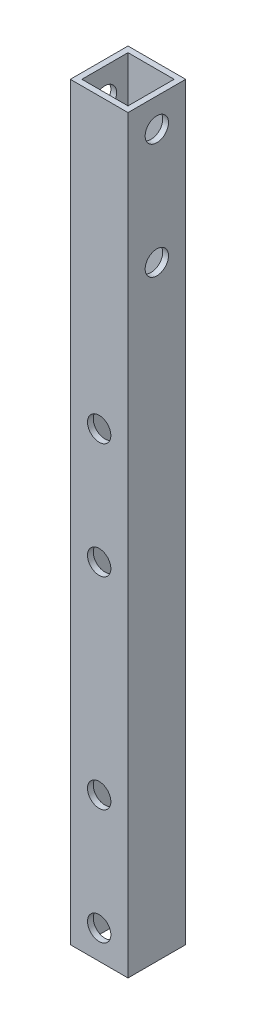
ISO-10303-21;
HEADER;
FILE_DESCRIPTION(('STEP AP214'),'2;1');
FILE_NAME('part.step','',(''),(''),'','','');
FILE_SCHEMA(('AUTOMOTIVE_DESIGN { 1 0 10303 214 1 1 1 1 }'));
ENDSEC;
DATA;
#1=APPLICATION_CONTEXT('core data for automotive mechanical design processes');
#2=APPLICATION_PROTOCOL_DEFINITION('international standard','automotive_design',2000,#1);
#3=PRODUCT_CONTEXT('',#1,'mechanical');
#4=PRODUCT('Part','Part','',(#3));
#5=PRODUCT_RELATED_PRODUCT_CATEGORY('part','',(#4));
#6=PRODUCT_DEFINITION_FORMATION('','',#4);
#7=PRODUCT_DEFINITION_CONTEXT('part definition',#1,'design');
#8=PRODUCT_DEFINITION('design','',#6,#7);
#9=PRODUCT_DEFINITION_SHAPE('','',#8);
#10=(LENGTH_UNIT() NAMED_UNIT(*) SI_UNIT(.MILLI.,.METRE.));
#11=(NAMED_UNIT(*) PLANE_ANGLE_UNIT() SI_UNIT($,.RADIAN.));
#12=(NAMED_UNIT(*) SI_UNIT($,.STERADIAN.) SOLID_ANGLE_UNIT());
#13=UNCERTAINTY_MEASURE_WITH_UNIT(LENGTH_MEASURE(1.E-05),#10,'distance_accuracy_value','');
#14=(GEOMETRIC_REPRESENTATION_CONTEXT(3) GLOBAL_UNCERTAINTY_ASSIGNED_CONTEXT((#13)) GLOBAL_UNIT_ASSIGNED_CONTEXT((#10,
#11,#12)) REPRESENTATION_CONTEXT('',''));
#15=CARTESIAN_POINT('',(0.,0.,0.));
#16=DIRECTION('',(0.,0.,1.));
#17=DIRECTION('',(1.,0.,0.));
#18=AXIS2_PLACEMENT_3D('',#15,#16,#17);
#19=CARTESIAN_POINT('',(0.,130.,0.));
#20=DIRECTION('',(0.,1.,0.));
#21=DIRECTION('',(0.,0.,1.));
#22=AXIS2_PLACEMENT_3D('',#19,#20,#21);
#23=PLANE('',#22);
#24=DIRECTION('',(0.,0.,-1.));
#25=VECTOR('',#24,1.);
#26=CARTESIAN_POINT('',(5.,130.,-5.));
#27=LINE('',#26,#25);
#28=CARTESIAN_POINT('',(5.,130.,5.));
#29=VERTEX_POINT('',#28);
#30=CARTESIAN_POINT('',(5.,130.,-5.));
#31=VERTEX_POINT('',#30);
#32=EDGE_CURVE('E156',#29,#31,#27,.T.);
#33=ORIENTED_EDGE('',*,*,#32,.T.);
#34=DIRECTION('',(-1.,0.,0.));
#35=VECTOR('',#34,1.);
#36=CARTESIAN_POINT('',(-5.,130.,-5.));
#37=LINE('',#36,#35);
#38=CARTESIAN_POINT('',(-5.,130.,-5.));
#39=VERTEX_POINT('',#38);
#40=EDGE_CURVE('E160',#31,#39,#37,.T.);
#41=ORIENTED_EDGE('',*,*,#40,.T.);
#42=DIRECTION('',(0.,0.,1.));
#43=VECTOR('',#42,1.);
#44=CARTESIAN_POINT('',(-5.,130.,-5.));
#45=LINE('',#44,#43);
#46=CARTESIAN_POINT('',(-5.,130.,5.));
#47=VERTEX_POINT('',#46);
#48=EDGE_CURVE('E164',#39,#47,#45,.T.);
#49=ORIENTED_EDGE('',*,*,#48,.T.);
#50=DIRECTION('',(1.,0.,0.));
#51=VECTOR('',#50,1.);
#52=CARTESIAN_POINT('',(-5.,130.,5.));
#53=LINE('',#52,#51);
#54=EDGE_CURVE('E167',#47,#29,#53,.T.);
#55=ORIENTED_EDGE('',*,*,#54,.T.);
#56=EDGE_LOOP('',(#33,#41,#49,#55));
#57=FACE_BOUND('',#56,.T.);
#58=DIRECTION('',(-1.,0.,0.));
#59=VECTOR('',#58,1.);
#60=CARTESIAN_POINT('',(-4.,130.,-4.));
#61=LINE('',#60,#59);
#62=CARTESIAN_POINT('',(4.,130.,-4.));
#63=VERTEX_POINT('',#62);
#64=CARTESIAN_POINT('',(-4.,130.,-4.));
#65=VERTEX_POINT('',#64);
#66=EDGE_CURVE('E115',#63,#65,#61,.T.);
#67=ORIENTED_EDGE('',*,*,#66,.F.);
#68=DIRECTION('',(0.,0.,-1.));
#69=VECTOR('',#68,1.);
#70=CARTESIAN_POINT('',(4.,130.,-4.));
#71=LINE('',#70,#69);
#72=CARTESIAN_POINT('',(4.,130.,4.));
#73=VERTEX_POINT('',#72);
#74=EDGE_CURVE('E106',#73,#63,#71,.T.);
#75=ORIENTED_EDGE('',*,*,#74,.F.);
#76=DIRECTION('',(1.,0.,0.));
#77=VECTOR('',#76,1.);
#78=CARTESIAN_POINT('',(-4.,130.,4.));
#79=LINE('',#78,#77);
#80=CARTESIAN_POINT('',(-4.,130.,4.));
#81=VERTEX_POINT('',#80);
#82=EDGE_CURVE('E132',#81,#73,#79,.T.);
#83=ORIENTED_EDGE('',*,*,#82,.F.);
#84=DIRECTION('',(0.,0.,1.));
#85=VECTOR('',#84,1.);
#86=CARTESIAN_POINT('',(-4.,130.,-4.));
#87=LINE('',#86,#85);
#88=EDGE_CURVE('E128',#65,#81,#87,.T.);
#89=ORIENTED_EDGE('',*,*,#88,.F.);
#90=EDGE_LOOP('',(#67,#75,#83,#89));
#91=FACE_BOUND('',#90,.T.);
#92=ADVANCED_FACE('F38',(#57,#91),#23,.T.);
#93=CARTESIAN_POINT('',(0.,0.,0.));
#94=DIRECTION('',(0.,1.,0.));
#95=DIRECTION('',(0.,0.,1.));
#96=AXIS2_PLACEMENT_3D('',#93,#94,#95);
#97=PLANE('',#96);
#98=DIRECTION('',(0.,0.,-1.));
#99=VECTOR('',#98,1.);
#100=CARTESIAN_POINT('',(5.,0.,-5.));
#101=LINE('',#100,#99);
#102=CARTESIAN_POINT('',(5.,0.,5.));
#103=VERTEX_POINT('',#102);
#104=CARTESIAN_POINT('',(5.,0.,-5.));
#105=VERTEX_POINT('',#104);
#106=EDGE_CURVE('E124',#103,#105,#101,.T.);
#107=ORIENTED_EDGE('',*,*,#106,.F.);
#108=DIRECTION('',(1.,0.,0.));
#109=VECTOR('',#108,1.);
#110=CARTESIAN_POINT('',(-5.,0.,5.));
#111=LINE('',#110,#109);
#112=CARTESIAN_POINT('',(-5.,0.,5.));
#113=VERTEX_POINT('',#112);
#114=EDGE_CURVE('E161',#113,#103,#111,.T.);
#115=ORIENTED_EDGE('',*,*,#114,.F.);
#116=DIRECTION('',(0.,0.,1.));
#117=VECTOR('',#116,1.);
#118=CARTESIAN_POINT('',(-5.,0.,-5.));
#119=LINE('',#118,#117);
#120=CARTESIAN_POINT('',(-5.,0.,-5.));
#121=VERTEX_POINT('',#120);
#122=EDGE_CURVE('E177',#121,#113,#119,.T.);
#123=ORIENTED_EDGE('',*,*,#122,.F.);
#124=DIRECTION('',(-1.,0.,0.));
#125=VECTOR('',#124,1.);
#126=CARTESIAN_POINT('',(-5.,0.,-5.));
#127=LINE('',#126,#125);
#128=EDGE_CURVE('E174',#105,#121,#127,.T.);
#129=ORIENTED_EDGE('',*,*,#128,.F.);
#130=EDGE_LOOP('',(#107,#115,#123,#129));
#131=FACE_BOUND('',#130,.T.);
#132=DIRECTION('',(0.,0.,-1.));
#133=VECTOR('',#132,1.);
#134=CARTESIAN_POINT('',(4.,0.,-4.));
#135=LINE('',#134,#133);
#136=CARTESIAN_POINT('',(4.,0.,4.));
#137=VERTEX_POINT('',#136);
#138=CARTESIAN_POINT('',(4.,0.,-4.));
#139=VERTEX_POINT('',#138);
#140=EDGE_CURVE('E64',#137,#139,#135,.T.);
#141=ORIENTED_EDGE('',*,*,#140,.T.);
#142=DIRECTION('',(-1.,0.,0.));
#143=VECTOR('',#142,1.);
#144=CARTESIAN_POINT('',(-4.,0.,-4.));
#145=LINE('',#144,#143);
#146=CARTESIAN_POINT('',(-4.,0.,-4.));
#147=VERTEX_POINT('',#146);
#148=EDGE_CURVE('E122',#139,#147,#145,.T.);
#149=ORIENTED_EDGE('',*,*,#148,.T.);
#150=DIRECTION('',(0.,0.,1.));
#151=VECTOR('',#150,1.);
#152=CARTESIAN_POINT('',(-4.,0.,-4.));
#153=LINE('',#152,#151);
#154=CARTESIAN_POINT('',(-4.,0.,4.));
#155=VERTEX_POINT('',#154);
#156=EDGE_CURVE('E143',#147,#155,#153,.T.);
#157=ORIENTED_EDGE('',*,*,#156,.T.);
#158=DIRECTION('',(1.,0.,0.));
#159=VECTOR('',#158,1.);
#160=CARTESIAN_POINT('',(-4.,0.,4.));
#161=LINE('',#160,#159);
#162=EDGE_CURVE('E116',#155,#137,#161,.T.);
#163=ORIENTED_EDGE('',*,*,#162,.T.);
#164=EDGE_LOOP('',(#141,#149,#157,#163));
#165=FACE_BOUND('',#164,.T.);
#166=ADVANCED_FACE('F317',(#131,#165),#97,.F.);
#167=CARTESIAN_POINT('',(5.,130.,-5.));
#168=DIRECTION('',(-1.,0.,0.));
#169=DIRECTION('',(0.,0.,1.));
#170=AXIS2_PLACEMENT_3D('',#167,#168,#169);
#171=PLANE('',#170);
#172=CARTESIAN_POINT('',(5.,125.,0.));
#173=DIRECTION('',(1.,0.,0.));
#174=DIRECTION('',(0.,0.,-1.));
#175=AXIS2_PLACEMENT_3D('',#172,#173,#174);
#176=CIRCLE('',#175,2.02500000000001);
#177=CARTESIAN_POINT('',(5.,125.,-2.02500000000001));
#178=VERTEX_POINT('',#177);
#179=EDGE_CURVE('E248',#178,#178,#176,.T.);
#180=ORIENTED_EDGE('',*,*,#179,.F.);
#181=EDGE_LOOP('',(#180));
#182=FACE_BOUND('',#181,.T.);
#183=CARTESIAN_POINT('',(5.,105.,0.));
#184=DIRECTION('',(1.,0.,0.));
#185=DIRECTION('',(0.,0.,-1.));
#186=AXIS2_PLACEMENT_3D('',#183,#184,#185);
#187=CIRCLE('',#186,2.025);
#188=CARTESIAN_POINT('',(5.,105.,-2.025));
#189=VERTEX_POINT('',#188);
#190=EDGE_CURVE('E244',#189,#189,#187,.T.);
#191=ORIENTED_EDGE('',*,*,#190,.F.);
#192=EDGE_LOOP('',(#191));
#193=FACE_BOUND('',#192,.T.);
#194=ORIENTED_EDGE('',*,*,#106,.T.);
#195=DIRECTION('',(0.,-1.,0.));
#196=VECTOR('',#195,1.);
#197=CARTESIAN_POINT('',(5.,130.,-5.));
#198=LINE('',#197,#196);
#199=EDGE_CURVE('E11',#31,#105,#198,.T.);
#200=ORIENTED_EDGE('',*,*,#199,.F.);
#201=ORIENTED_EDGE('',*,*,#32,.F.);
#202=DIRECTION('',(0.,-1.,0.));
#203=VECTOR('',#202,1.);
#204=CARTESIAN_POINT('',(5.,130.,5.));
#205=LINE('',#204,#203);
#206=EDGE_CURVE('E170',#29,#103,#205,.T.);
#207=ORIENTED_EDGE('',*,*,#206,.T.);
#208=EDGE_LOOP('',(#194,#200,#201,#207));
#209=FACE_BOUND('',#208,.T.);
#210=ADVANCED_FACE('F40',(#182,#193,#209),#171,.F.);
#211=CARTESIAN_POINT('',(-5.,130.,-5.));
#212=DIRECTION('',(0.,0.,1.));
#213=DIRECTION('',(1.,0.,0.));
#214=AXIS2_PLACEMENT_3D('',#211,#212,#213);
#215=PLANE('',#214);
#216=CARTESIAN_POINT('',(0.,60.,-5.));
#217=DIRECTION('',(0.,0.,1.));
#218=DIRECTION('',(1.,0.,0.));
#219=AXIS2_PLACEMENT_3D('',#216,#217,#218);
#220=CIRCLE('',#219,2.025);
#221=CARTESIAN_POINT('',(2.025,60.,-5.));
#222=VERTEX_POINT('',#221);
#223=EDGE_CURVE('E216',#222,#222,#220,.T.);
#224=ORIENTED_EDGE('',*,*,#223,.T.);
#225=EDGE_LOOP('',(#224));
#226=FACE_BOUND('',#225,.T.);
#227=CARTESIAN_POINT('',(0.,80.,-5.));
#228=DIRECTION('',(0.,0.,1.));
#229=DIRECTION('',(1.,0.,0.));
#230=AXIS2_PLACEMENT_3D('',#227,#228,#229);
#231=CIRCLE('',#230,2.025);
#232=CARTESIAN_POINT('',(2.025,80.,-5.));
#233=VERTEX_POINT('',#232);
#234=EDGE_CURVE('E230',#233,#233,#231,.T.);
#235=ORIENTED_EDGE('',*,*,#234,.T.);
#236=EDGE_LOOP('',(#235));
#237=FACE_BOUND('',#236,.T.);
#238=CARTESIAN_POINT('',(0.,5.,-5.));
#239=DIRECTION('',(0.,0.,1.));
#240=DIRECTION('',(1.,0.,0.));
#241=AXIS2_PLACEMENT_3D('',#238,#239,#240);
#242=CIRCLE('',#241,2.025);
#243=CARTESIAN_POINT('',(2.025,5.,-5.));
#244=VERTEX_POINT('',#243);
#245=EDGE_CURVE('E197',#244,#244,#242,.T.);
#246=ORIENTED_EDGE('',*,*,#245,.T.);
#247=EDGE_LOOP('',(#246));
#248=FACE_BOUND('',#247,.T.);
#249=CARTESIAN_POINT('',(0.,25.,-5.));
#250=DIRECTION('',(0.,0.,1.));
#251=DIRECTION('',(1.,0.,0.));
#252=AXIS2_PLACEMENT_3D('',#249,#250,#251);
#253=CIRCLE('',#252,2.025);
#254=CARTESIAN_POINT('',(2.025,25.,-5.));
#255=VERTEX_POINT('',#254);
#256=EDGE_CURVE('E273',#255,#255,#253,.T.);
#257=ORIENTED_EDGE('',*,*,#256,.T.);
#258=EDGE_LOOP('',(#257));
#259=FACE_BOUND('',#258,.T.);
#260=ORIENTED_EDGE('',*,*,#128,.T.);
#261=DIRECTION('',(0.,-1.,0.));
#262=VECTOR('',#261,1.);
#263=CARTESIAN_POINT('',(-5.,130.,-5.));
#264=LINE('',#263,#262);
#265=EDGE_CURVE('E48',#39,#121,#264,.T.);
#266=ORIENTED_EDGE('',*,*,#265,.F.);
#267=ORIENTED_EDGE('',*,*,#40,.F.);
#268=ORIENTED_EDGE('',*,*,#199,.T.);
#269=EDGE_LOOP('',(#260,#266,#267,#268));
#270=FACE_BOUND('',#269,.T.);
#271=ADVANCED_FACE('F304',(#226,#237,#248,#259,#270),#215,.F.);
#272=CARTESIAN_POINT('',(-5.,130.,-5.));
#273=DIRECTION('',(1.,0.,0.));
#274=DIRECTION('',(0.,0.,-1.));
#275=AXIS2_PLACEMENT_3D('',#272,#273,#274);
#276=PLANE('',#275);
#277=CARTESIAN_POINT('',(-5.,125.,0.));
#278=DIRECTION('',(1.,0.,0.));
#279=DIRECTION('',(0.,0.,-1.));
#280=AXIS2_PLACEMENT_3D('',#277,#278,#279);
#281=CIRCLE('',#280,2.02500000000001);
#282=CARTESIAN_POINT('',(-5.,125.,-2.02500000000001));
#283=VERTEX_POINT('',#282);
#284=EDGE_CURVE('E207',#283,#283,#281,.T.);
#285=ORIENTED_EDGE('',*,*,#284,.T.);
#286=EDGE_LOOP('',(#285));
#287=FACE_BOUND('',#286,.T.);
#288=CARTESIAN_POINT('',(-5.,105.,0.));
#289=DIRECTION('',(1.,0.,0.));
#290=DIRECTION('',(0.,0.,-1.));
#291=AXIS2_PLACEMENT_3D('',#288,#289,#290);
#292=CIRCLE('',#291,2.025);
#293=CARTESIAN_POINT('',(-5.,105.,-2.025));
#294=VERTEX_POINT('',#293);
#295=EDGE_CURVE('E252',#294,#294,#292,.T.);
#296=ORIENTED_EDGE('',*,*,#295,.T.);
#297=EDGE_LOOP('',(#296));
#298=FACE_BOUND('',#297,.T.);
#299=ORIENTED_EDGE('',*,*,#122,.T.);
#300=DIRECTION('',(0.,-1.,0.));
#301=VECTOR('',#300,1.);
#302=CARTESIAN_POINT('',(-5.,130.,5.));
#303=LINE('',#302,#301);
#304=EDGE_CURVE('E185',#47,#113,#303,.T.);
#305=ORIENTED_EDGE('',*,*,#304,.F.);
#306=ORIENTED_EDGE('',*,*,#48,.F.);
#307=ORIENTED_EDGE('',*,*,#265,.T.);
#308=EDGE_LOOP('',(#299,#305,#306,#307));
#309=FACE_BOUND('',#308,.T.);
#310=ADVANCED_FACE('F307',(#287,#298,#309),#276,.F.);
#311=CARTESIAN_POINT('',(-5.,130.,5.));
#312=DIRECTION('',(0.,0.,-1.));
#313=DIRECTION('',(-1.,0.,0.));
#314=AXIS2_PLACEMENT_3D('',#311,#312,#313);
#315=PLANE('',#314);
#316=CARTESIAN_POINT('',(0.,60.,5.));
#317=DIRECTION('',(0.,0.,1.));
#318=DIRECTION('',(1.,0.,0.));
#319=AXIS2_PLACEMENT_3D('',#316,#317,#318);
#320=CIRCLE('',#319,2.025);
#321=CARTESIAN_POINT('',(2.025,60.,5.));
#322=VERTEX_POINT('',#321);
#323=EDGE_CURVE('E224',#322,#322,#320,.T.);
#324=ORIENTED_EDGE('',*,*,#323,.F.);
#325=EDGE_LOOP('',(#324));
#326=FACE_BOUND('',#325,.T.);
#327=CARTESIAN_POINT('',(0.,80.,5.));
#328=DIRECTION('',(0.,0.,1.));
#329=DIRECTION('',(1.,0.,0.));
#330=AXIS2_PLACEMENT_3D('',#327,#328,#329);
#331=CIRCLE('',#330,2.025);
#332=CARTESIAN_POINT('',(2.025,80.,5.));
#333=VERTEX_POINT('',#332);
#334=EDGE_CURVE('E236',#333,#333,#331,.T.);
#335=ORIENTED_EDGE('',*,*,#334,.F.);
#336=EDGE_LOOP('',(#335));
#337=FACE_BOUND('',#336,.T.);
#338=CARTESIAN_POINT('',(0.,5.,5.));
#339=DIRECTION('',(0.,0.,1.));
#340=DIRECTION('',(1.,0.,0.));
#341=AXIS2_PLACEMENT_3D('',#338,#339,#340);
#342=CIRCLE('',#341,2.025);
#343=CARTESIAN_POINT('',(2.025,5.,5.));
#344=VERTEX_POINT('',#343);
#345=EDGE_CURVE('E269',#344,#344,#342,.T.);
#346=ORIENTED_EDGE('',*,*,#345,.F.);
#347=EDGE_LOOP('',(#346));
#348=FACE_BOUND('',#347,.T.);
#349=CARTESIAN_POINT('',(0.,25.,5.));
#350=DIRECTION('',(0.,0.,1.));
#351=DIRECTION('',(1.,0.,0.));
#352=AXIS2_PLACEMENT_3D('',#349,#350,#351);
#353=CIRCLE('',#352,2.025);
#354=CARTESIAN_POINT('',(2.025,25.,5.));
#355=VERTEX_POINT('',#354);
#356=EDGE_CURVE('E265',#355,#355,#353,.T.);
#357=ORIENTED_EDGE('',*,*,#356,.F.);
#358=EDGE_LOOP('',(#357));
#359=FACE_BOUND('',#358,.T.);
#360=ORIENTED_EDGE('',*,*,#114,.T.);
#361=ORIENTED_EDGE('',*,*,#206,.F.);
#362=ORIENTED_EDGE('',*,*,#54,.F.);
#363=ORIENTED_EDGE('',*,*,#304,.T.);
#364=EDGE_LOOP('',(#360,#361,#362,#363));
#365=FACE_BOUND('',#364,.T.);
#366=ADVANCED_FACE('F321',(#326,#337,#348,#359,#365),#315,.F.);
#367=CARTESIAN_POINT('',(4.,130.,-4.));
#368=DIRECTION('',(-1.,0.,0.));
#369=DIRECTION('',(0.,0.,1.));
#370=AXIS2_PLACEMENT_3D('',#367,#368,#369);
#371=PLANE('',#370);
#372=CARTESIAN_POINT('',(4.,125.,0.));
#373=DIRECTION('',(-1.,0.,0.));
#374=DIRECTION('',(0.,0.,1.));
#375=AXIS2_PLACEMENT_3D('',#372,#373,#374);
#376=CIRCLE('',#375,2.02500000000001);
#377=CARTESIAN_POINT('',(4.,125.,2.02500000000001));
#378=VERTEX_POINT('',#377);
#379=EDGE_CURVE('E211',#378,#378,#376,.T.);
#380=ORIENTED_EDGE('',*,*,#379,.F.);
#381=EDGE_LOOP('',(#380));
#382=FACE_BOUND('',#381,.T.);
#383=CARTESIAN_POINT('',(4.,105.,0.));
#384=DIRECTION('',(-1.,0.,0.));
#385=DIRECTION('',(0.,0.,1.));
#386=AXIS2_PLACEMENT_3D('',#383,#384,#385);
#387=CIRCLE('',#386,2.025);
#388=CARTESIAN_POINT('',(4.,105.,2.02499999999999));
#389=VERTEX_POINT('',#388);
#390=EDGE_CURVE('E206',#389,#389,#387,.T.);
#391=ORIENTED_EDGE('',*,*,#390,.F.);
#392=EDGE_LOOP('',(#391));
#393=FACE_BOUND('',#392,.T.);
#394=ORIENTED_EDGE('',*,*,#140,.F.);
#395=DIRECTION('',(0.,-1.,0.));
#396=VECTOR('',#395,1.);
#397=CARTESIAN_POINT('',(4.,130.,4.));
#398=LINE('',#397,#396);
#399=EDGE_CURVE('E110',#73,#137,#398,.T.);
#400=ORIENTED_EDGE('',*,*,#399,.F.);
#401=ORIENTED_EDGE('',*,*,#74,.T.);
#402=DIRECTION('',(0.,-1.,0.));
#403=VECTOR('',#402,1.);
#404=CARTESIAN_POINT('',(4.,130.,-4.));
#405=LINE('',#404,#403);
#406=EDGE_CURVE('E109',#63,#139,#405,.T.);
#407=ORIENTED_EDGE('',*,*,#406,.T.);
#408=EDGE_LOOP('',(#394,#400,#401,#407));
#409=FACE_BOUND('',#408,.T.);
#410=ADVANCED_FACE('F108',(#382,#393,#409),#371,.T.);
#411=CARTESIAN_POINT('',(-4.,130.,-4.));
#412=DIRECTION('',(0.,0.,1.));
#413=DIRECTION('',(1.,0.,0.));
#414=AXIS2_PLACEMENT_3D('',#411,#412,#413);
#415=PLANE('',#414);
#416=CARTESIAN_POINT('',(0.,60.,-4.));
#417=DIRECTION('',(0.,0.,1.));
#418=DIRECTION('',(1.,0.,0.));
#419=AXIS2_PLACEMENT_3D('',#416,#417,#418);
#420=CIRCLE('',#419,2.025);
#421=CARTESIAN_POINT('',(2.025,60.,-4.));
#422=VERTEX_POINT('',#421);
#423=EDGE_CURVE('E240',#422,#422,#420,.T.);
#424=ORIENTED_EDGE('',*,*,#423,.F.);
#425=EDGE_LOOP('',(#424));
#426=FACE_BOUND('',#425,.T.);
#427=CARTESIAN_POINT('',(0.,80.,-4.));
#428=DIRECTION('',(0.,0.,1.));
#429=DIRECTION('',(1.,0.,0.));
#430=AXIS2_PLACEMENT_3D('',#427,#428,#429);
#431=CIRCLE('',#430,2.025);
#432=CARTESIAN_POINT('',(2.025,80.,-4.));
#433=VERTEX_POINT('',#432);
#434=EDGE_CURVE('E215',#433,#433,#431,.T.);
#435=ORIENTED_EDGE('',*,*,#434,.F.);
#436=EDGE_LOOP('',(#435));
#437=FACE_BOUND('',#436,.T.);
#438=CARTESIAN_POINT('',(0.,5.,-4.));
#439=DIRECTION('',(0.,0.,1.));
#440=DIRECTION('',(1.,0.,0.));
#441=AXIS2_PLACEMENT_3D('',#438,#439,#440);
#442=CIRCLE('',#441,2.025);
#443=CARTESIAN_POINT('',(2.025,5.,-4.));
#444=VERTEX_POINT('',#443);
#445=EDGE_CURVE('E140',#444,#444,#442,.T.);
#446=ORIENTED_EDGE('',*,*,#445,.F.);
#447=EDGE_LOOP('',(#446));
#448=FACE_BOUND('',#447,.T.);
#449=CARTESIAN_POINT('',(0.,25.,-4.));
#450=DIRECTION('',(0.,0.,1.));
#451=DIRECTION('',(1.,0.,0.));
#452=AXIS2_PLACEMENT_3D('',#449,#450,#451);
#453=CIRCLE('',#452,2.025);
#454=CARTESIAN_POINT('',(2.025,25.,-4.));
#455=VERTEX_POINT('',#454);
#456=EDGE_CURVE('E196',#455,#455,#453,.T.);
#457=ORIENTED_EDGE('',*,*,#456,.F.);
#458=EDGE_LOOP('',(#457));
#459=FACE_BOUND('',#458,.T.);
#460=ORIENTED_EDGE('',*,*,#148,.F.);
#461=ORIENTED_EDGE('',*,*,#406,.F.);
#462=ORIENTED_EDGE('',*,*,#66,.T.);
#463=DIRECTION('',(0.,-1.,0.));
#464=VECTOR('',#463,1.);
#465=CARTESIAN_POINT('',(-4.,130.,-4.));
#466=LINE('',#465,#464);
#467=EDGE_CURVE('E125',#65,#147,#466,.T.);
#468=ORIENTED_EDGE('',*,*,#467,.T.);
#469=EDGE_LOOP('',(#460,#461,#462,#468));
#470=FACE_BOUND('',#469,.T.);
#471=ADVANCED_FACE('F119',(#426,#437,#448,#459,#470),#415,.T.);
#472=CARTESIAN_POINT('',(-4.,130.,-4.));
#473=DIRECTION('',(1.,0.,0.));
#474=DIRECTION('',(0.,0.,-1.));
#475=AXIS2_PLACEMENT_3D('',#472,#473,#474);
#476=PLANE('',#475);
#477=CARTESIAN_POINT('',(-4.,125.,0.));
#478=DIRECTION('',(1.,0.,0.));
#479=DIRECTION('',(0.,0.,-1.));
#480=AXIS2_PLACEMENT_3D('',#477,#478,#479);
#481=CIRCLE('',#480,2.02500000000001);
#482=CARTESIAN_POINT('',(-4.,125.,-2.02500000000001));
#483=VERTEX_POINT('',#482);
#484=EDGE_CURVE('E208',#483,#483,#481,.T.);
#485=ORIENTED_EDGE('',*,*,#484,.F.);
#486=EDGE_LOOP('',(#485));
#487=FACE_BOUND('',#486,.T.);
#488=CARTESIAN_POINT('',(-4.,105.,0.));
#489=DIRECTION('',(1.,0.,0.));
#490=DIRECTION('',(0.,0.,-1.));
#491=AXIS2_PLACEMENT_3D('',#488,#489,#490);
#492=CIRCLE('',#491,2.025);
#493=CARTESIAN_POINT('',(-4.,105.,-2.025));
#494=VERTEX_POINT('',#493);
#495=EDGE_CURVE('E202',#494,#494,#492,.T.);
#496=ORIENTED_EDGE('',*,*,#495,.F.);
#497=EDGE_LOOP('',(#496));
#498=FACE_BOUND('',#497,.T.);
#499=ORIENTED_EDGE('',*,*,#156,.F.);
#500=ORIENTED_EDGE('',*,*,#467,.F.);
#501=ORIENTED_EDGE('',*,*,#88,.T.);
#502=DIRECTION('',(0.,-1.,0.));
#503=VECTOR('',#502,1.);
#504=CARTESIAN_POINT('',(-4.,130.,4.));
#505=LINE('',#504,#503);
#506=EDGE_CURVE('E56',#81,#155,#505,.T.);
#507=ORIENTED_EDGE('',*,*,#506,.T.);
#508=EDGE_LOOP('',(#499,#500,#501,#507));
#509=FACE_BOUND('',#508,.T.);
#510=ADVANCED_FACE('F291',(#487,#498,#509),#476,.T.);
#511=CARTESIAN_POINT('',(-4.,130.,4.));
#512=DIRECTION('',(0.,0.,-1.));
#513=DIRECTION('',(-1.,0.,0.));
#514=AXIS2_PLACEMENT_3D('',#511,#512,#513);
#515=PLANE('',#514);
#516=CARTESIAN_POINT('',(0.,60.,4.));
#517=DIRECTION('',(0.,0.,-1.));
#518=DIRECTION('',(-1.,0.,0.));
#519=AXIS2_PLACEMENT_3D('',#516,#517,#518);
#520=CIRCLE('',#519,2.025);
#521=CARTESIAN_POINT('',(-2.025,60.,4.));
#522=VERTEX_POINT('',#521);
#523=EDGE_CURVE('E42',#522,#522,#520,.T.);
#524=ORIENTED_EDGE('',*,*,#523,.F.);
#525=EDGE_LOOP('',(#524));
#526=FACE_BOUND('',#525,.T.);
#527=CARTESIAN_POINT('',(0.,80.,4.));
#528=DIRECTION('',(0.,0.,-1.));
#529=DIRECTION('',(-1.,0.,0.));
#530=AXIS2_PLACEMENT_3D('',#527,#528,#529);
#531=CIRCLE('',#530,2.025);
#532=CARTESIAN_POINT('',(-2.025,80.,4.));
#533=VERTEX_POINT('',#532);
#534=EDGE_CURVE('E212',#533,#533,#531,.T.);
#535=ORIENTED_EDGE('',*,*,#534,.F.);
#536=EDGE_LOOP('',(#535));
#537=FACE_BOUND('',#536,.T.);
#538=CARTESIAN_POINT('',(0.,5.,4.));
#539=DIRECTION('',(0.,0.,-1.));
#540=DIRECTION('',(-1.,0.,0.));
#541=AXIS2_PLACEMENT_3D('',#538,#539,#540);
#542=CIRCLE('',#541,2.025);
#543=CARTESIAN_POINT('',(-2.025,5.,4.));
#544=VERTEX_POINT('',#543);
#545=EDGE_CURVE('E198',#544,#544,#542,.T.);
#546=ORIENTED_EDGE('',*,*,#545,.F.);
#547=EDGE_LOOP('',(#546));
#548=FACE_BOUND('',#547,.T.);
#549=CARTESIAN_POINT('',(0.,25.,4.));
#550=DIRECTION('',(0.,0.,-1.));
#551=DIRECTION('',(-1.,0.,0.));
#552=AXIS2_PLACEMENT_3D('',#549,#550,#551);
#553=CIRCLE('',#552,2.025);
#554=CARTESIAN_POINT('',(-2.025,25.,4.));
#555=VERTEX_POINT('',#554);
#556=EDGE_CURVE('E192',#555,#555,#553,.T.);
#557=ORIENTED_EDGE('',*,*,#556,.F.);
#558=EDGE_LOOP('',(#557));
#559=FACE_BOUND('',#558,.T.);
#560=ORIENTED_EDGE('',*,*,#162,.F.);
#561=ORIENTED_EDGE('',*,*,#506,.F.);
#562=ORIENTED_EDGE('',*,*,#82,.T.);
#563=ORIENTED_EDGE('',*,*,#399,.T.);
#564=EDGE_LOOP('',(#560,#561,#562,#563));
#565=FACE_BOUND('',#564,.T.);
#566=ADVANCED_FACE('F406',(#526,#537,#548,#559,#565),#515,.T.);
#567=CARTESIAN_POINT('',(0.,25.,-5.));
#568=DIRECTION('',(0.,0.,1.));
#569=DIRECTION('',(1.,0.,0.));
#570=AXIS2_PLACEMENT_3D('',#567,#568,#569);
#571=CYLINDRICAL_SURFACE('',#570,2.025);
#572=ORIENTED_EDGE('',*,*,#556,.T.);
#573=EDGE_LOOP('',(#572));
#574=FACE_BOUND('',#573,.T.);
#575=ORIENTED_EDGE('',*,*,#356,.T.);
#576=EDGE_LOOP('',(#575));
#577=FACE_BOUND('',#576,.T.);
#578=ADVANCED_FACE('F301',(#574,#577),#571,.F.);
#579=CARTESIAN_POINT('',(0.,5.,-5.));
#580=DIRECTION('',(0.,0.,1.));
#581=DIRECTION('',(1.,0.,0.));
#582=AXIS2_PLACEMENT_3D('',#579,#580,#581);
#583=CYLINDRICAL_SURFACE('',#582,2.025);
#584=ORIENTED_EDGE('',*,*,#545,.T.);
#585=EDGE_LOOP('',(#584));
#586=FACE_BOUND('',#585,.T.);
#587=ORIENTED_EDGE('',*,*,#345,.T.);
#588=EDGE_LOOP('',(#587));
#589=FACE_BOUND('',#588,.T.);
#590=ADVANCED_FACE('F299',(#586,#589),#583,.F.);
#591=ORIENTED_EDGE('',*,*,#456,.T.);
#592=EDGE_LOOP('',(#591));
#593=FACE_BOUND('',#592,.T.);
#594=ORIENTED_EDGE('',*,*,#256,.F.);
#595=EDGE_LOOP('',(#594));
#596=FACE_BOUND('',#595,.T.);
#597=ADVANCED_FACE('F296',(#593,#596),#571,.F.);
#598=ORIENTED_EDGE('',*,*,#445,.T.);
#599=EDGE_LOOP('',(#598));
#600=FACE_BOUND('',#599,.T.);
#601=ORIENTED_EDGE('',*,*,#245,.F.);
#602=EDGE_LOOP('',(#601));
#603=FACE_BOUND('',#602,.T.);
#604=ADVANCED_FACE('F286',(#600,#603),#583,.F.);
#605=CARTESIAN_POINT('',(-5.,105.,0.));
#606=DIRECTION('',(1.,0.,0.));
#607=DIRECTION('',(0.,0.,-1.));
#608=AXIS2_PLACEMENT_3D('',#605,#606,#607);
#609=CYLINDRICAL_SURFACE('',#608,2.025);
#610=ORIENTED_EDGE('',*,*,#495,.T.);
#611=EDGE_LOOP('',(#610));
#612=FACE_BOUND('',#611,.T.);
#613=ORIENTED_EDGE('',*,*,#295,.F.);
#614=EDGE_LOOP('',(#613));
#615=FACE_BOUND('',#614,.T.);
#616=ADVANCED_FACE('F347',(#612,#615),#609,.F.);
#617=CARTESIAN_POINT('',(-5.,125.,0.));
#618=DIRECTION('',(1.,0.,0.));
#619=DIRECTION('',(0.,0.,-1.));
#620=AXIS2_PLACEMENT_3D('',#617,#618,#619);
#621=CYLINDRICAL_SURFACE('',#620,2.02500000000001);
#622=ORIENTED_EDGE('',*,*,#484,.T.);
#623=EDGE_LOOP('',(#622));
#624=FACE_BOUND('',#623,.T.);
#625=ORIENTED_EDGE('',*,*,#284,.F.);
#626=EDGE_LOOP('',(#625));
#627=FACE_BOUND('',#626,.T.);
#628=ADVANCED_FACE('F349',(#624,#627),#621,.F.);
#629=ORIENTED_EDGE('',*,*,#390,.T.);
#630=EDGE_LOOP('',(#629));
#631=FACE_BOUND('',#630,.T.);
#632=ORIENTED_EDGE('',*,*,#190,.T.);
#633=EDGE_LOOP('',(#632));
#634=FACE_BOUND('',#633,.T.);
#635=ADVANCED_FACE('F352',(#631,#634),#609,.F.);
#636=ORIENTED_EDGE('',*,*,#379,.T.);
#637=EDGE_LOOP('',(#636));
#638=FACE_BOUND('',#637,.T.);
#639=ORIENTED_EDGE('',*,*,#179,.T.);
#640=EDGE_LOOP('',(#639));
#641=FACE_BOUND('',#640,.T.);
#642=ADVANCED_FACE('F359',(#638,#641),#621,.F.);
#643=CARTESIAN_POINT('',(0.,80.,-5.));
#644=DIRECTION('',(0.,0.,1.));
#645=DIRECTION('',(1.,0.,0.));
#646=AXIS2_PLACEMENT_3D('',#643,#644,#645);
#647=CYLINDRICAL_SURFACE('',#646,2.025);
#648=ORIENTED_EDGE('',*,*,#534,.T.);
#649=EDGE_LOOP('',(#648));
#650=FACE_BOUND('',#649,.T.);
#651=ORIENTED_EDGE('',*,*,#334,.T.);
#652=EDGE_LOOP('',(#651));
#653=FACE_BOUND('',#652,.T.);
#654=ADVANCED_FACE('F366',(#650,#653),#647,.F.);
#655=CARTESIAN_POINT('',(0.,60.,-5.));
#656=DIRECTION('',(0.,0.,1.));
#657=DIRECTION('',(1.,0.,0.));
#658=AXIS2_PLACEMENT_3D('',#655,#656,#657);
#659=CYLINDRICAL_SURFACE('',#658,2.025);
#660=ORIENTED_EDGE('',*,*,#523,.T.);
#661=EDGE_LOOP('',(#660));
#662=FACE_BOUND('',#661,.T.);
#663=ORIENTED_EDGE('',*,*,#323,.T.);
#664=EDGE_LOOP('',(#663));
#665=FACE_BOUND('',#664,.T.);
#666=ADVANCED_FACE('F469',(#662,#665),#659,.F.);
#667=ORIENTED_EDGE('',*,*,#434,.T.);
#668=EDGE_LOOP('',(#667));
#669=FACE_BOUND('',#668,.T.);
#670=ORIENTED_EDGE('',*,*,#234,.F.);
#671=EDGE_LOOP('',(#670));
#672=FACE_BOUND('',#671,.T.);
#673=ADVANCED_FACE('F471',(#669,#672),#647,.F.);
#674=ORIENTED_EDGE('',*,*,#423,.T.);
#675=EDGE_LOOP('',(#674));
#676=FACE_BOUND('',#675,.T.);
#677=ORIENTED_EDGE('',*,*,#223,.F.);
#678=EDGE_LOOP('',(#677));
#679=FACE_BOUND('',#678,.T.);
#680=ADVANCED_FACE('F482',(#676,#679),#659,.F.);
#681=CLOSED_SHELL('',(#92,#166,#210,#271,#310,#366,#410,#471,#510,#566,#578,#590,#597,#604,#616,
#628,#635,#642,#654,#666,#673,#680));
#682=MANIFOLD_SOLID_BREP('B2',#681);
#683=ADVANCED_BREP_SHAPE_REPRESENTATION('',(#18,#682),#14);
#684=SHAPE_DEFINITION_REPRESENTATION(#9,#683);
ENDSEC;
END-ISO-10303-21;
